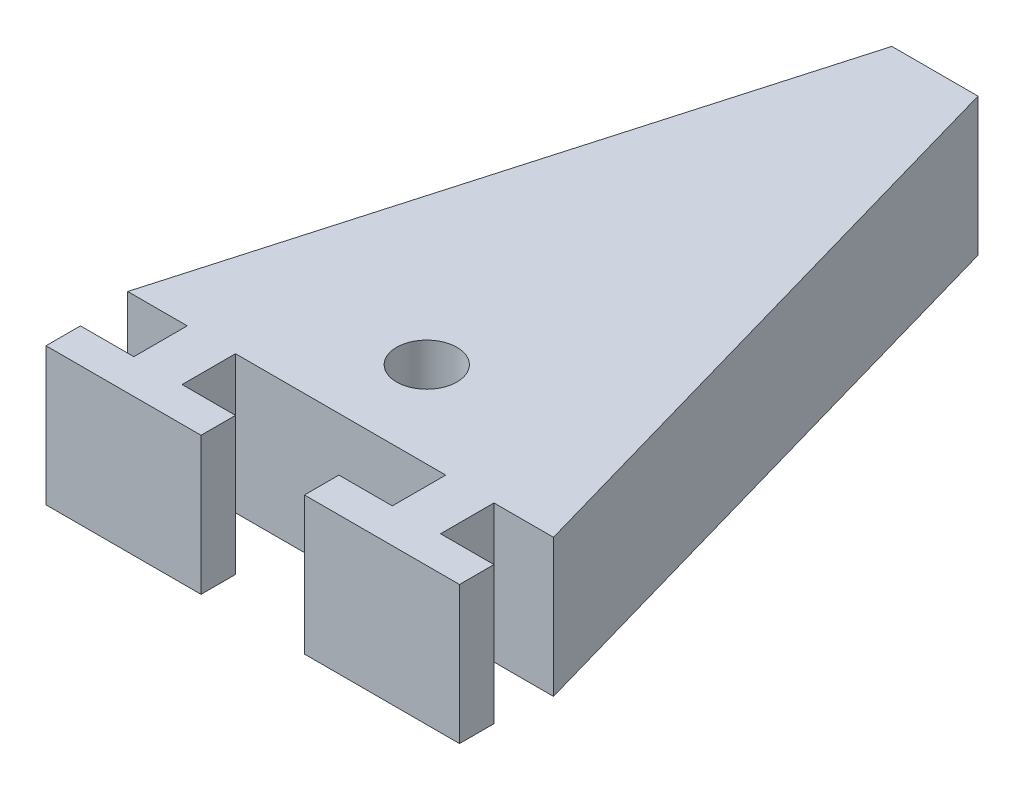
ISO-10303-21;
HEADER;
FILE_DESCRIPTION(('STEP AP214'),'2;1');
FILE_NAME('part.step','',(''),(''),'','','');
FILE_SCHEMA(('AUTOMOTIVE_DESIGN { 1 0 10303 214 1 1 1 1 }'));
ENDSEC;
DATA;
#1=APPLICATION_CONTEXT('core data for automotive mechanical design processes');
#2=APPLICATION_PROTOCOL_DEFINITION('international standard','automotive_design',2000,#1);
#3=PRODUCT_CONTEXT('',#1,'mechanical');
#4=PRODUCT('Part','Part','',(#3));
#5=PRODUCT_RELATED_PRODUCT_CATEGORY('part','',(#4));
#6=PRODUCT_DEFINITION_FORMATION('','',#4);
#7=PRODUCT_DEFINITION_CONTEXT('part definition',#1,'design');
#8=PRODUCT_DEFINITION('design','',#6,#7);
#9=PRODUCT_DEFINITION_SHAPE('','',#8);
#10=(LENGTH_UNIT() NAMED_UNIT(*) SI_UNIT(.MILLI.,.METRE.));
#11=(NAMED_UNIT(*) PLANE_ANGLE_UNIT() SI_UNIT($,.RADIAN.));
#12=(NAMED_UNIT(*) SI_UNIT($,.STERADIAN.) SOLID_ANGLE_UNIT());
#13=UNCERTAINTY_MEASURE_WITH_UNIT(LENGTH_MEASURE(1.E-05),#10,'distance_accuracy_value','');
#14=(GEOMETRIC_REPRESENTATION_CONTEXT(3) GLOBAL_UNCERTAINTY_ASSIGNED_CONTEXT((#13)) GLOBAL_UNIT_ASSIGNED_CONTEXT((#10,
#11,#12)) REPRESENTATION_CONTEXT('',''));
#15=CARTESIAN_POINT('',(0.,0.,0.));
#16=DIRECTION('',(0.,0.,1.));
#17=DIRECTION('',(1.,0.,0.));
#18=AXIS2_PLACEMENT_3D('',#15,#16,#17);
#19=CARTESIAN_POINT('',(12.5,8.,0.));
#20=DIRECTION('',(-0.961523947640823,0.,0.274721127897378));
#21=DIRECTION('',(0.274721127897378,0.,0.961523947640823));
#22=AXIS2_PLACEMENT_3D('',#19,#20,#21);
#23=PLANE('',#22);
#24=DIRECTION('',(-0.274721127897378,0.,-0.961523947640823));
#25=VECTOR('',#24,1.);
#26=CARTESIAN_POINT('',(12.5,8.,0.));
#27=LINE('',#26,#25);
#28=CARTESIAN_POINT('',(12.3571428571429,8.,-0.5));
#29=VERTEX_POINT('',#28);
#30=CARTESIAN_POINT('',(2.5,8.,-35.));
#31=VERTEX_POINT('',#30);
#32=EDGE_CURVE('E167',#29,#31,#27,.T.);
#33=ORIENTED_EDGE('',*,*,#32,.F.);
#34=DIRECTION('',(0.,1.,0.));
#35=VECTOR('',#34,1.);
#36=CARTESIAN_POINT('',(12.3571428571429,0.,-0.5));
#37=LINE('',#36,#35);
#38=CARTESIAN_POINT('',(12.3571428571429,0.,-0.5));
#39=VERTEX_POINT('',#38);
#40=EDGE_CURVE('E229',#39,#29,#37,.T.);
#41=ORIENTED_EDGE('',*,*,#40,.F.);
#42=DIRECTION('',(-0.274721127897378,0.,-0.961523947640823));
#43=VECTOR('',#42,1.);
#44=CARTESIAN_POINT('',(12.5,0.,0.));
#45=LINE('',#44,#43);
#46=CARTESIAN_POINT('',(2.5,0.,-35.));
#47=VERTEX_POINT('',#46);
#48=EDGE_CURVE('E60',#39,#47,#45,.T.);
#49=ORIENTED_EDGE('',*,*,#48,.T.);
#50=DIRECTION('',(0.,-1.,0.));
#51=VECTOR('',#50,1.);
#52=CARTESIAN_POINT('',(2.5,8.,-35.));
#53=LINE('',#52,#51);
#54=EDGE_CURVE('E11',#31,#47,#53,.T.);
#55=ORIENTED_EDGE('',*,*,#54,.F.);
#56=EDGE_LOOP('',(#33,#41,#49,#55));
#57=FACE_BOUND('',#56,.T.);
#58=ADVANCED_FACE('F33',(#57),#23,.F.);
#59=CARTESIAN_POINT('',(2.5,8.,-35.));
#60=DIRECTION('',(0.,0.,1.));
#61=DIRECTION('',(1.,0.,0.));
#62=AXIS2_PLACEMENT_3D('',#59,#60,#61);
#63=PLANE('',#62);
#64=DIRECTION('',(-1.,0.,0.));
#65=VECTOR('',#64,1.);
#66=CARTESIAN_POINT('',(2.5,0.,-35.));
#67=LINE('',#66,#65);
#68=CARTESIAN_POINT('',(-2.5,0.,-35.));
#69=VERTEX_POINT('',#68);
#70=EDGE_CURVE('E174',#47,#69,#67,.T.);
#71=ORIENTED_EDGE('',*,*,#70,.T.);
#72=DIRECTION('',(0.,-1.,0.));
#73=VECTOR('',#72,1.);
#74=CARTESIAN_POINT('',(-2.5,8.,-35.));
#75=LINE('',#74,#73);
#76=CARTESIAN_POINT('',(-2.5,8.,-35.));
#77=VERTEX_POINT('',#76);
#78=EDGE_CURVE('E41',#77,#69,#75,.T.);
#79=ORIENTED_EDGE('',*,*,#78,.F.);
#80=DIRECTION('',(-1.,0.,0.));
#81=VECTOR('',#80,1.);
#82=CARTESIAN_POINT('',(2.5,8.,-35.));
#83=LINE('',#82,#81);
#84=EDGE_CURVE('E49',#31,#77,#83,.T.);
#85=ORIENTED_EDGE('',*,*,#84,.F.);
#86=ORIENTED_EDGE('',*,*,#54,.T.);
#87=EDGE_LOOP('',(#71,#79,#85,#86));
#88=FACE_BOUND('',#87,.T.);
#89=ADVANCED_FACE('F410',(#88),#63,.F.);
#90=CARTESIAN_POINT('',(-2.5,8.,-35.));
#91=DIRECTION('',(0.961523947640823,0.,0.274721127897378));
#92=DIRECTION('',(0.274721127897378,0.,-0.961523947640823));
#93=AXIS2_PLACEMENT_3D('',#90,#91,#92);
#94=PLANE('',#93);
#95=DIRECTION('',(-0.274721127897378,0.,0.961523947640823));
#96=VECTOR('',#95,1.);
#97=CARTESIAN_POINT('',(-2.5,0.,-35.));
#98=LINE('',#97,#96);
#99=CARTESIAN_POINT('',(-12.3571428571429,0.,-0.5));
#100=VERTEX_POINT('',#99);
#101=EDGE_CURVE('E169',#69,#100,#98,.T.);
#102=ORIENTED_EDGE('',*,*,#101,.T.);
#103=DIRECTION('',(0.,1.,0.));
#104=VECTOR('',#103,1.);
#105=CARTESIAN_POINT('',(-12.3571428571429,0.,-0.5));
#106=LINE('',#105,#104);
#107=CARTESIAN_POINT('',(-12.3571428571429,8.,-0.5));
#108=VERTEX_POINT('',#107);
#109=EDGE_CURVE('E203',#100,#108,#106,.T.);
#110=ORIENTED_EDGE('',*,*,#109,.T.);
#111=DIRECTION('',(-0.274721127897378,0.,0.961523947640823));
#112=VECTOR('',#111,1.);
#113=CARTESIAN_POINT('',(-2.5,8.,-35.));
#114=LINE('',#113,#112);
#115=EDGE_CURVE('E171',#77,#108,#114,.T.);
#116=ORIENTED_EDGE('',*,*,#115,.F.);
#117=ORIENTED_EDGE('',*,*,#78,.T.);
#118=EDGE_LOOP('',(#102,#110,#116,#117));
#119=FACE_BOUND('',#118,.T.);
#120=ADVANCED_FACE('F181',(#119),#94,.F.);
#121=CARTESIAN_POINT('',(0.,8.,0.));
#122=DIRECTION('',(0.,1.,0.));
#123=DIRECTION('',(0.,0.,1.));
#124=AXIS2_PLACEMENT_3D('',#121,#122,#123);
#125=PLANE('',#124);
#126=CARTESIAN_POINT('',(0.,8.,-5.5));
#127=DIRECTION('',(0.,-1.,0.));
#128=DIRECTION('',(0.,0.,-1.));
#129=AXIS2_PLACEMENT_3D('',#126,#127,#128);
#130=CIRCLE('',#129,1.75);
#131=CARTESIAN_POINT('',(0.,8.,-7.25));
#132=VERTEX_POINT('',#131);
#133=EDGE_CURVE('E233',#132,#132,#130,.T.);
#134=ORIENTED_EDGE('',*,*,#133,.T.);
#135=EDGE_LOOP('',(#134));
#136=FACE_BOUND('',#135,.T.);
#137=DIRECTION('',(-1.,0.,0.));
#138=VECTOR('',#137,1.);
#139=CARTESIAN_POINT('',(-8.90166666666667,8.,-0.5));
#140=LINE('',#139,#138);
#141=CARTESIAN_POINT('',(-8.90166666666667,8.,-0.5));
#142=VERTEX_POINT('',#141);
#143=EDGE_CURVE('E201',#142,#108,#140,.T.);
#144=ORIENTED_EDGE('',*,*,#143,.F.);
#145=DIRECTION('',(0.,0.,1.));
#146=VECTOR('',#145,1.);
#147=CARTESIAN_POINT('',(-8.90166666666667,8.,0.));
#148=LINE('',#147,#146);
#149=CARTESIAN_POINT('',(-8.90166666666667,8.,2.6));
#150=VERTEX_POINT('',#149);
#151=EDGE_CURVE('E103',#142,#150,#148,.T.);
#152=ORIENTED_EDGE('',*,*,#151,.T.);
#153=DIRECTION('',(-1.,0.,0.));
#154=VECTOR('',#153,1.);
#155=CARTESIAN_POINT('',(-8.90166666666667,8.,2.6));
#156=LINE('',#155,#154);
#157=CARTESIAN_POINT('',(-12.0016666666667,8.,2.6));
#158=VERTEX_POINT('',#157);
#159=EDGE_CURVE('E297',#150,#158,#156,.T.);
#160=ORIENTED_EDGE('',*,*,#159,.T.);
#161=DIRECTION('',(0.,0.,1.));
#162=VECTOR('',#161,1.);
#163=CARTESIAN_POINT('',(-12.0016666666667,8.,2.6));
#164=LINE('',#163,#162);
#165=CARTESIAN_POINT('',(-12.0016666666667,8.,4.6));
#166=VERTEX_POINT('',#165);
#167=EDGE_CURVE('E121',#158,#166,#164,.T.);
#168=ORIENTED_EDGE('',*,*,#167,.T.);
#169=DIRECTION('',(1.,0.,0.));
#170=VECTOR('',#169,1.);
#171=CARTESIAN_POINT('',(-12.0016666666667,8.,4.6));
#172=LINE('',#171,#170);
#173=CARTESIAN_POINT('',(-3.00166666666666,8.,4.6));
#174=VERTEX_POINT('',#173);
#175=EDGE_CURVE('E114',#166,#174,#172,.T.);
#176=ORIENTED_EDGE('',*,*,#175,.T.);
#177=DIRECTION('',(0.,0.,-1.));
#178=VECTOR('',#177,1.);
#179=CARTESIAN_POINT('',(-3.00166666666666,8.,4.6));
#180=LINE('',#179,#178);
#181=CARTESIAN_POINT('',(-3.00166666666667,8.,2.6));
#182=VERTEX_POINT('',#181);
#183=EDGE_CURVE('E118',#174,#182,#180,.T.);
#184=ORIENTED_EDGE('',*,*,#183,.T.);
#185=DIRECTION('',(-1.,0.,0.));
#186=VECTOR('',#185,1.);
#187=CARTESIAN_POINT('',(-3.00166666666667,8.,2.6));
#188=LINE('',#187,#186);
#189=CARTESIAN_POINT('',(-6.10166666666667,8.,2.6));
#190=VERTEX_POINT('',#189);
#191=EDGE_CURVE('E68',#182,#190,#188,.T.);
#192=ORIENTED_EDGE('',*,*,#191,.T.);
#193=DIRECTION('',(0.,0.,-1.));
#194=VECTOR('',#193,1.);
#195=CARTESIAN_POINT('',(-6.10166666666667,8.,2.6));
#196=LINE('',#195,#194);
#197=CARTESIAN_POINT('',(-6.10166666666667,8.,-0.5));
#198=VERTEX_POINT('',#197);
#199=EDGE_CURVE('E138',#190,#198,#196,.T.);
#200=ORIENTED_EDGE('',*,*,#199,.T.);
#201=DIRECTION('',(-1.,0.,0.));
#202=VECTOR('',#201,1.);
#203=CARTESIAN_POINT('',(-6.10166666666667,8.,-0.5));
#204=LINE('',#203,#202);
#205=CARTESIAN_POINT('',(6.10166666666667,8.,-0.5));
#206=VERTEX_POINT('',#205);
#207=EDGE_CURVE('E218',#206,#198,#204,.T.);
#208=ORIENTED_EDGE('',*,*,#207,.F.);
#209=DIRECTION('',(0.,0.,-1.));
#210=VECTOR('',#209,1.);
#211=CARTESIAN_POINT('',(6.10166666666667,8.,2.6));
#212=LINE('',#211,#210);
#213=CARTESIAN_POINT('',(6.10166666666667,8.,2.6));
#214=VERTEX_POINT('',#213);
#215=EDGE_CURVE('E238',#214,#206,#212,.T.);
#216=ORIENTED_EDGE('',*,*,#215,.F.);
#217=DIRECTION('',(1.,0.,0.));
#218=VECTOR('',#217,1.);
#219=CARTESIAN_POINT('',(3.00166666666667,8.,2.6));
#220=LINE('',#219,#218);
#221=CARTESIAN_POINT('',(3.00166666666667,8.,2.6));
#222=VERTEX_POINT('',#221);
#223=EDGE_CURVE('E241',#222,#214,#220,.T.);
#224=ORIENTED_EDGE('',*,*,#223,.F.);
#225=DIRECTION('',(0.,0.,-1.));
#226=VECTOR('',#225,1.);
#227=CARTESIAN_POINT('',(3.00166666666666,8.,4.6));
#228=LINE('',#227,#226);
#229=CARTESIAN_POINT('',(3.00166666666666,8.,4.6));
#230=VERTEX_POINT('',#229);
#231=EDGE_CURVE('E245',#230,#222,#228,.T.);
#232=ORIENTED_EDGE('',*,*,#231,.F.);
#233=DIRECTION('',(-1.,0.,0.));
#234=VECTOR('',#233,1.);
#235=CARTESIAN_POINT('',(12.0016666666667,8.,4.6));
#236=LINE('',#235,#234);
#237=CARTESIAN_POINT('',(12.0016666666667,8.,4.6));
#238=VERTEX_POINT('',#237);
#239=EDGE_CURVE('E248',#238,#230,#236,.T.);
#240=ORIENTED_EDGE('',*,*,#239,.F.);
#241=DIRECTION('',(0.,0.,1.));
#242=VECTOR('',#241,1.);
#243=CARTESIAN_POINT('',(12.0016666666667,8.,2.6));
#244=LINE('',#243,#242);
#245=CARTESIAN_POINT('',(12.0016666666667,8.,2.6));
#246=VERTEX_POINT('',#245);
#247=EDGE_CURVE('E251',#246,#238,#244,.T.);
#248=ORIENTED_EDGE('',*,*,#247,.F.);
#249=DIRECTION('',(1.,0.,0.));
#250=VECTOR('',#249,1.);
#251=CARTESIAN_POINT('',(8.90166666666667,8.,2.6));
#252=LINE('',#251,#250);
#253=CARTESIAN_POINT('',(8.90166666666667,8.,2.6));
#254=VERTEX_POINT('',#253);
#255=EDGE_CURVE('E254',#254,#246,#252,.T.);
#256=ORIENTED_EDGE('',*,*,#255,.F.);
#257=DIRECTION('',(0.,0.,1.));
#258=VECTOR('',#257,1.);
#259=CARTESIAN_POINT('',(8.90166666666667,8.,0.));
#260=LINE('',#259,#258);
#261=CARTESIAN_POINT('',(8.90166666666667,8.,-0.5));
#262=VERTEX_POINT('',#261);
#263=EDGE_CURVE('E257',#262,#254,#260,.T.);
#264=ORIENTED_EDGE('',*,*,#263,.F.);
#265=DIRECTION('',(-1.,0.,0.));
#266=VECTOR('',#265,1.);
#267=CARTESIAN_POINT('',(8.90166666666667,8.,-0.5));
#268=LINE('',#267,#266);
#269=EDGE_CURVE('E230',#29,#262,#268,.T.);
#270=ORIENTED_EDGE('',*,*,#269,.F.);
#271=ORIENTED_EDGE('',*,*,#32,.T.);
#272=ORIENTED_EDGE('',*,*,#84,.T.);
#273=ORIENTED_EDGE('',*,*,#115,.T.);
#274=EDGE_LOOP('',(#144,#152,#160,#168,#176,#184,#192,#200,#208,#216,#224,#232,#240,#248,#256,
#264,#270,#271,#272,#273));
#275=FACE_BOUND('',#274,.T.);
#276=ADVANCED_FACE('F116',(#136,#275),#125,.T.);
#277=CARTESIAN_POINT('',(0.,0.,0.));
#278=DIRECTION('',(0.,1.,0.));
#279=DIRECTION('',(0.,0.,1.));
#280=AXIS2_PLACEMENT_3D('',#277,#278,#279);
#281=PLANE('',#280);
#282=CARTESIAN_POINT('',(0.,0.,-5.5));
#283=DIRECTION('',(0.,-1.,0.));
#284=DIRECTION('',(0.,0.,-1.));
#285=AXIS2_PLACEMENT_3D('',#282,#283,#284);
#286=CIRCLE('',#285,1.75);
#287=CARTESIAN_POINT('',(0.,0.,-7.25));
#288=VERTEX_POINT('',#287);
#289=EDGE_CURVE('E209',#288,#288,#286,.T.);
#290=ORIENTED_EDGE('',*,*,#289,.F.);
#291=EDGE_LOOP('',(#290));
#292=FACE_BOUND('',#291,.T.);
#293=DIRECTION('',(0.,0.,1.));
#294=VECTOR('',#293,1.);
#295=CARTESIAN_POINT('',(-8.90166666666667,0.,0.));
#296=LINE('',#295,#294);
#297=CARTESIAN_POINT('',(-8.90166666666667,0.,-0.5));
#298=VERTEX_POINT('',#297);
#299=CARTESIAN_POINT('',(-8.90166666666667,0.,2.6));
#300=VERTEX_POINT('',#299);
#301=EDGE_CURVE('E144',#298,#300,#296,.T.);
#302=ORIENTED_EDGE('',*,*,#301,.F.);
#303=DIRECTION('',(-1.,0.,0.));
#304=VECTOR('',#303,1.);
#305=CARTESIAN_POINT('',(-8.90166666666667,0.,-0.5));
#306=LINE('',#305,#304);
#307=EDGE_CURVE('E191',#298,#100,#306,.T.);
#308=ORIENTED_EDGE('',*,*,#307,.T.);
#309=ORIENTED_EDGE('',*,*,#101,.F.);
#310=ORIENTED_EDGE('',*,*,#70,.F.);
#311=ORIENTED_EDGE('',*,*,#48,.F.);
#312=DIRECTION('',(-1.,0.,0.));
#313=VECTOR('',#312,1.);
#314=CARTESIAN_POINT('',(8.90166666666667,0.,-0.5));
#315=LINE('',#314,#313);
#316=CARTESIAN_POINT('',(8.90166666666667,0.,-0.5));
#317=VERTEX_POINT('',#316);
#318=EDGE_CURVE('E226',#39,#317,#315,.T.);
#319=ORIENTED_EDGE('',*,*,#318,.T.);
#320=DIRECTION('',(0.,0.,1.));
#321=VECTOR('',#320,1.);
#322=CARTESIAN_POINT('',(8.90166666666667,0.,0.));
#323=LINE('',#322,#321);
#324=CARTESIAN_POINT('',(8.90166666666667,0.,2.6));
#325=VERTEX_POINT('',#324);
#326=EDGE_CURVE('E242',#317,#325,#323,.T.);
#327=ORIENTED_EDGE('',*,*,#326,.T.);
#328=DIRECTION('',(1.,0.,0.));
#329=VECTOR('',#328,1.);
#330=CARTESIAN_POINT('',(8.90166666666667,0.,2.6));
#331=LINE('',#330,#329);
#332=CARTESIAN_POINT('',(12.0016666666667,0.,2.6));
#333=VERTEX_POINT('',#332);
#334=EDGE_CURVE('E275',#325,#333,#331,.T.);
#335=ORIENTED_EDGE('',*,*,#334,.T.);
#336=DIRECTION('',(0.,0.,1.));
#337=VECTOR('',#336,1.);
#338=CARTESIAN_POINT('',(12.0016666666667,0.,2.6));
#339=LINE('',#338,#337);
#340=CARTESIAN_POINT('',(12.0016666666667,0.,4.6));
#341=VERTEX_POINT('',#340);
#342=EDGE_CURVE('E272',#333,#341,#339,.T.);
#343=ORIENTED_EDGE('',*,*,#342,.T.);
#344=DIRECTION('',(-1.,0.,0.));
#345=VECTOR('',#344,1.);
#346=CARTESIAN_POINT('',(12.0016666666667,0.,4.6));
#347=LINE('',#346,#345);
#348=CARTESIAN_POINT('',(3.00166666666666,0.,4.6));
#349=VERTEX_POINT('',#348);
#350=EDGE_CURVE('E269',#341,#349,#347,.T.);
#351=ORIENTED_EDGE('',*,*,#350,.T.);
#352=DIRECTION('',(0.,0.,-1.));
#353=VECTOR('',#352,1.);
#354=CARTESIAN_POINT('',(3.00166666666666,0.,4.6));
#355=LINE('',#354,#353);
#356=CARTESIAN_POINT('',(3.00166666666667,0.,2.6));
#357=VERTEX_POINT('',#356);
#358=EDGE_CURVE('E266',#349,#357,#355,.T.);
#359=ORIENTED_EDGE('',*,*,#358,.T.);
#360=DIRECTION('',(1.,0.,0.));
#361=VECTOR('',#360,1.);
#362=CARTESIAN_POINT('',(3.00166666666667,0.,2.6));
#363=LINE('',#362,#361);
#364=CARTESIAN_POINT('',(6.10166666666667,0.,2.6));
#365=VERTEX_POINT('',#364);
#366=EDGE_CURVE('E263',#357,#365,#363,.T.);
#367=ORIENTED_EDGE('',*,*,#366,.T.);
#368=DIRECTION('',(0.,0.,-1.));
#369=VECTOR('',#368,1.);
#370=CARTESIAN_POINT('',(6.10166666666667,0.,2.6));
#371=LINE('',#370,#369);
#372=CARTESIAN_POINT('',(6.10166666666667,0.,-0.5));
#373=VERTEX_POINT('',#372);
#374=EDGE_CURVE('E212',#365,#373,#371,.T.);
#375=ORIENTED_EDGE('',*,*,#374,.T.);
#376=DIRECTION('',(-1.,0.,0.));
#377=VECTOR('',#376,1.);
#378=CARTESIAN_POINT('',(-6.10166666666667,0.,-0.5));
#379=LINE('',#378,#377);
#380=CARTESIAN_POINT('',(-6.10166666666667,0.,-0.5));
#381=VERTEX_POINT('',#380);
#382=EDGE_CURVE('E214',#373,#381,#379,.T.);
#383=ORIENTED_EDGE('',*,*,#382,.T.);
#384=DIRECTION('',(0.,0.,-1.));
#385=VECTOR('',#384,1.);
#386=CARTESIAN_POINT('',(-6.10166666666667,0.,2.6));
#387=LINE('',#386,#385);
#388=CARTESIAN_POINT('',(-6.10166666666667,0.,2.6));
#389=VERTEX_POINT('',#388);
#390=EDGE_CURVE('E155',#389,#381,#387,.T.);
#391=ORIENTED_EDGE('',*,*,#390,.F.);
#392=DIRECTION('',(-1.,0.,0.));
#393=VECTOR('',#392,1.);
#394=CARTESIAN_POINT('',(-3.00166666666667,0.,2.6));
#395=LINE('',#394,#393);
#396=CARTESIAN_POINT('',(-3.00166666666667,0.,2.6));
#397=VERTEX_POINT('',#396);
#398=EDGE_CURVE('E95',#397,#389,#395,.T.);
#399=ORIENTED_EDGE('',*,*,#398,.F.);
#400=DIRECTION('',(0.,0.,-1.));
#401=VECTOR('',#400,1.);
#402=CARTESIAN_POINT('',(-3.00166666666666,0.,4.6));
#403=LINE('',#402,#401);
#404=CARTESIAN_POINT('',(-3.00166666666666,0.,4.6));
#405=VERTEX_POINT('',#404);
#406=EDGE_CURVE('E152',#405,#397,#403,.T.);
#407=ORIENTED_EDGE('',*,*,#406,.F.);
#408=DIRECTION('',(1.,0.,0.));
#409=VECTOR('',#408,1.);
#410=CARTESIAN_POINT('',(-12.0016666666667,0.,4.6));
#411=LINE('',#410,#409);
#412=CARTESIAN_POINT('',(-12.0016666666667,0.,4.6));
#413=VERTEX_POINT('',#412);
#414=EDGE_CURVE('E130',#413,#405,#411,.T.);
#415=ORIENTED_EDGE('',*,*,#414,.F.);
#416=DIRECTION('',(0.,0.,1.));
#417=VECTOR('',#416,1.);
#418=CARTESIAN_POINT('',(-12.0016666666667,0.,2.6));
#419=LINE('',#418,#417);
#420=CARTESIAN_POINT('',(-12.0016666666667,0.,2.6));
#421=VERTEX_POINT('',#420);
#422=EDGE_CURVE('E149',#421,#413,#419,.T.);
#423=ORIENTED_EDGE('',*,*,#422,.F.);
#424=DIRECTION('',(-1.,0.,0.));
#425=VECTOR('',#424,1.);
#426=CARTESIAN_POINT('',(-8.90166666666667,0.,2.6));
#427=LINE('',#426,#425);
#428=EDGE_CURVE('E146',#300,#421,#427,.T.);
#429=ORIENTED_EDGE('',*,*,#428,.F.);
#430=EDGE_LOOP('',(#302,#308,#309,#310,#311,#319,#327,#335,#343,#351,#359,#367,#375,#383,#391,
#399,#407,#415,#423,#429));
#431=FACE_BOUND('',#430,.T.);
#432=ADVANCED_FACE('F189',(#292,#431),#281,.F.);
#433=CARTESIAN_POINT('',(-8.90166666666667,8.,0.));
#434=DIRECTION('',(1.,0.,0.));
#435=DIRECTION('',(0.,0.,-1.));
#436=AXIS2_PLACEMENT_3D('',#433,#434,#435);
#437=PLANE('',#436);
#438=ORIENTED_EDGE('',*,*,#301,.T.);
#439=DIRECTION('',(0.,-1.,0.));
#440=VECTOR('',#439,1.);
#441=CARTESIAN_POINT('',(-8.90166666666667,8.,2.6));
#442=LINE('',#441,#440);
#443=EDGE_CURVE('E164',#150,#300,#442,.T.);
#444=ORIENTED_EDGE('',*,*,#443,.F.);
#445=ORIENTED_EDGE('',*,*,#151,.F.);
#446=DIRECTION('',(0.,1.,0.));
#447=VECTOR('',#446,1.);
#448=CARTESIAN_POINT('',(-8.90166666666667,0.,-0.5));
#449=LINE('',#448,#447);
#450=EDGE_CURVE('E200',#298,#142,#449,.T.);
#451=ORIENTED_EDGE('',*,*,#450,.F.);
#452=EDGE_LOOP('',(#438,#444,#445,#451));
#453=FACE_BOUND('',#452,.T.);
#454=ADVANCED_FACE('F398',(#453),#437,.F.);
#455=CARTESIAN_POINT('',(-8.90166666666667,8.,2.6));
#456=DIRECTION('',(0.,0.,1.));
#457=DIRECTION('',(1.,0.,0.));
#458=AXIS2_PLACEMENT_3D('',#455,#456,#457);
#459=PLANE('',#458);
#460=ORIENTED_EDGE('',*,*,#428,.T.);
#461=DIRECTION('',(0.,-1.,0.));
#462=VECTOR('',#461,1.);
#463=CARTESIAN_POINT('',(-12.0016666666667,8.,2.6));
#464=LINE('',#463,#462);
#465=EDGE_CURVE('E161',#158,#421,#464,.T.);
#466=ORIENTED_EDGE('',*,*,#465,.F.);
#467=ORIENTED_EDGE('',*,*,#159,.F.);
#468=ORIENTED_EDGE('',*,*,#443,.T.);
#469=EDGE_LOOP('',(#460,#466,#467,#468));
#470=FACE_BOUND('',#469,.T.);
#471=ADVANCED_FACE('F301',(#470),#459,.F.);
#472=CARTESIAN_POINT('',(-12.0016666666667,8.,2.6));
#473=DIRECTION('',(1.,0.,0.));
#474=DIRECTION('',(0.,0.,-1.));
#475=AXIS2_PLACEMENT_3D('',#472,#473,#474);
#476=PLANE('',#475);
#477=ORIENTED_EDGE('',*,*,#422,.T.);
#478=DIRECTION('',(0.,-1.,0.));
#479=VECTOR('',#478,1.);
#480=CARTESIAN_POINT('',(-12.0016666666667,8.,4.6));
#481=LINE('',#480,#479);
#482=EDGE_CURVE('E133',#166,#413,#481,.T.);
#483=ORIENTED_EDGE('',*,*,#482,.F.);
#484=ORIENTED_EDGE('',*,*,#167,.F.);
#485=ORIENTED_EDGE('',*,*,#465,.T.);
#486=EDGE_LOOP('',(#477,#483,#484,#485));
#487=FACE_BOUND('',#486,.T.);
#488=ADVANCED_FACE('F304',(#487),#476,.F.);
#489=CARTESIAN_POINT('',(-12.0016666666667,8.,4.6));
#490=DIRECTION('',(0.,0.,-1.));
#491=DIRECTION('',(-1.,0.,0.));
#492=AXIS2_PLACEMENT_3D('',#489,#490,#491);
#493=PLANE('',#492);
#494=ORIENTED_EDGE('',*,*,#414,.T.);
#495=DIRECTION('',(0.,-1.,0.));
#496=VECTOR('',#495,1.);
#497=CARTESIAN_POINT('',(-3.00166666666666,8.,4.6));
#498=LINE('',#497,#496);
#499=EDGE_CURVE('E127',#174,#405,#498,.T.);
#500=ORIENTED_EDGE('',*,*,#499,.F.);
#501=ORIENTED_EDGE('',*,*,#175,.F.);
#502=ORIENTED_EDGE('',*,*,#482,.T.);
#503=EDGE_LOOP('',(#494,#500,#501,#502));
#504=FACE_BOUND('',#503,.T.);
#505=ADVANCED_FACE('F128',(#504),#493,.F.);
#506=CARTESIAN_POINT('',(-3.00166666666666,8.,4.6));
#507=DIRECTION('',(-1.,0.,0.));
#508=DIRECTION('',(0.,0.,1.));
#509=AXIS2_PLACEMENT_3D('',#506,#507,#508);
#510=PLANE('',#509);
#511=ORIENTED_EDGE('',*,*,#406,.T.);
#512=DIRECTION('',(0.,-1.,0.));
#513=VECTOR('',#512,1.);
#514=CARTESIAN_POINT('',(-3.00166666666667,8.,2.6));
#515=LINE('',#514,#513);
#516=EDGE_CURVE('E134',#182,#397,#515,.T.);
#517=ORIENTED_EDGE('',*,*,#516,.F.);
#518=ORIENTED_EDGE('',*,*,#183,.F.);
#519=ORIENTED_EDGE('',*,*,#499,.T.);
#520=EDGE_LOOP('',(#511,#517,#518,#519));
#521=FACE_BOUND('',#520,.T.);
#522=ADVANCED_FACE('F136',(#521),#510,.F.);
#523=CARTESIAN_POINT('',(-3.00166666666667,8.,2.6));
#524=DIRECTION('',(0.,0.,1.));
#525=DIRECTION('',(1.,0.,0.));
#526=AXIS2_PLACEMENT_3D('',#523,#524,#525);
#527=PLANE('',#526);
#528=ORIENTED_EDGE('',*,*,#398,.T.);
#529=DIRECTION('',(0.,-1.,0.));
#530=VECTOR('',#529,1.);
#531=CARTESIAN_POINT('',(-6.10166666666667,8.,2.6));
#532=LINE('',#531,#530);
#533=EDGE_CURVE('E143',#190,#389,#532,.T.);
#534=ORIENTED_EDGE('',*,*,#533,.F.);
#535=ORIENTED_EDGE('',*,*,#191,.F.);
#536=ORIENTED_EDGE('',*,*,#516,.T.);
#537=EDGE_LOOP('',(#528,#534,#535,#536));
#538=FACE_BOUND('',#537,.T.);
#539=ADVANCED_FACE('F306',(#538),#527,.F.);
#540=CARTESIAN_POINT('',(-6.10166666666667,8.,2.6));
#541=DIRECTION('',(-1.,0.,0.));
#542=DIRECTION('',(0.,0.,1.));
#543=AXIS2_PLACEMENT_3D('',#540,#541,#542);
#544=PLANE('',#543);
#545=ORIENTED_EDGE('',*,*,#390,.T.);
#546=DIRECTION('',(0.,1.,0.));
#547=VECTOR('',#546,1.);
#548=CARTESIAN_POINT('',(-6.10166666666667,0.,-0.5));
#549=LINE('',#548,#547);
#550=EDGE_CURVE('E206',#381,#198,#549,.T.);
#551=ORIENTED_EDGE('',*,*,#550,.T.);
#552=ORIENTED_EDGE('',*,*,#199,.F.);
#553=ORIENTED_EDGE('',*,*,#533,.T.);
#554=EDGE_LOOP('',(#545,#551,#552,#553));
#555=FACE_BOUND('',#554,.T.);
#556=ADVANCED_FACE('F309',(#555),#544,.F.);
#557=CARTESIAN_POINT('',(6.10166666666667,8.,2.6));
#558=DIRECTION('',(-1.,0.,0.));
#559=DIRECTION('',(0.,0.,1.));
#560=AXIS2_PLACEMENT_3D('',#557,#558,#559);
#561=PLANE('',#560);
#562=ORIENTED_EDGE('',*,*,#374,.F.);
#563=DIRECTION('',(0.,-1.,0.));
#564=VECTOR('',#563,1.);
#565=CARTESIAN_POINT('',(6.10166666666667,8.,2.6));
#566=LINE('',#565,#564);
#567=EDGE_CURVE('E147',#214,#365,#566,.T.);
#568=ORIENTED_EDGE('',*,*,#567,.F.);
#569=ORIENTED_EDGE('',*,*,#215,.T.);
#570=DIRECTION('',(0.,1.,0.));
#571=VECTOR('',#570,1.);
#572=CARTESIAN_POINT('',(6.10166666666667,0.,-0.5));
#573=LINE('',#572,#571);
#574=EDGE_CURVE('E217',#373,#206,#573,.T.);
#575=ORIENTED_EDGE('',*,*,#574,.F.);
#576=EDGE_LOOP('',(#562,#568,#569,#575));
#577=FACE_BOUND('',#576,.T.);
#578=ADVANCED_FACE('F388',(#577),#561,.T.);
#579=CARTESIAN_POINT('',(3.00166666666667,8.,2.6));
#580=DIRECTION('',(0.,0.,-1.));
#581=DIRECTION('',(-1.,0.,0.));
#582=AXIS2_PLACEMENT_3D('',#579,#580,#581);
#583=PLANE('',#582);
#584=ORIENTED_EDGE('',*,*,#366,.F.);
#585=DIRECTION('',(0.,-1.,0.));
#586=VECTOR('',#585,1.);
#587=CARTESIAN_POINT('',(3.00166666666667,8.,2.6));
#588=LINE('',#587,#586);
#589=EDGE_CURVE('E291',#222,#357,#588,.T.);
#590=ORIENTED_EDGE('',*,*,#589,.F.);
#591=ORIENTED_EDGE('',*,*,#223,.T.);
#592=ORIENTED_EDGE('',*,*,#567,.T.);
#593=EDGE_LOOP('',(#584,#590,#591,#592));
#594=FACE_BOUND('',#593,.T.);
#595=ADVANCED_FACE('F383',(#594),#583,.T.);
#596=CARTESIAN_POINT('',(3.00166666666666,8.,4.6));
#597=DIRECTION('',(-1.,0.,0.));
#598=DIRECTION('',(0.,0.,1.));
#599=AXIS2_PLACEMENT_3D('',#596,#597,#598);
#600=PLANE('',#599);
#601=ORIENTED_EDGE('',*,*,#358,.F.);
#602=DIRECTION('',(0.,-1.,0.));
#603=VECTOR('',#602,1.);
#604=CARTESIAN_POINT('',(3.00166666666666,8.,4.6));
#605=LINE('',#604,#603);
#606=EDGE_CURVE('E288',#230,#349,#605,.T.);
#607=ORIENTED_EDGE('',*,*,#606,.F.);
#608=ORIENTED_EDGE('',*,*,#231,.T.);
#609=ORIENTED_EDGE('',*,*,#589,.T.);
#610=EDGE_LOOP('',(#601,#607,#608,#609));
#611=FACE_BOUND('',#610,.T.);
#612=ADVANCED_FACE('F379',(#611),#600,.T.);
#613=CARTESIAN_POINT('',(12.0016666666667,8.,4.6));
#614=DIRECTION('',(0.,0.,1.));
#615=DIRECTION('',(1.,0.,0.));
#616=AXIS2_PLACEMENT_3D('',#613,#614,#615);
#617=PLANE('',#616);
#618=ORIENTED_EDGE('',*,*,#350,.F.);
#619=DIRECTION('',(0.,-1.,0.));
#620=VECTOR('',#619,1.);
#621=CARTESIAN_POINT('',(12.0016666666667,8.,4.6));
#622=LINE('',#621,#620);
#623=EDGE_CURVE('E285',#238,#341,#622,.T.);
#624=ORIENTED_EDGE('',*,*,#623,.F.);
#625=ORIENTED_EDGE('',*,*,#239,.T.);
#626=ORIENTED_EDGE('',*,*,#606,.T.);
#627=EDGE_LOOP('',(#618,#624,#625,#626));
#628=FACE_BOUND('',#627,.T.);
#629=ADVANCED_FACE('F377',(#628),#617,.T.);
#630=CARTESIAN_POINT('',(12.0016666666667,8.,2.6));
#631=DIRECTION('',(1.,0.,0.));
#632=DIRECTION('',(0.,0.,-1.));
#633=AXIS2_PLACEMENT_3D('',#630,#631,#632);
#634=PLANE('',#633);
#635=ORIENTED_EDGE('',*,*,#342,.F.);
#636=DIRECTION('',(0.,-1.,0.));
#637=VECTOR('',#636,1.);
#638=CARTESIAN_POINT('',(12.0016666666667,8.,2.6));
#639=LINE('',#638,#637);
#640=EDGE_CURVE('E282',#246,#333,#639,.T.);
#641=ORIENTED_EDGE('',*,*,#640,.F.);
#642=ORIENTED_EDGE('',*,*,#247,.T.);
#643=ORIENTED_EDGE('',*,*,#623,.T.);
#644=EDGE_LOOP('',(#635,#641,#642,#643));
#645=FACE_BOUND('',#644,.T.);
#646=ADVANCED_FACE('F373',(#645),#634,.T.);
#647=CARTESIAN_POINT('',(8.90166666666667,8.,2.6));
#648=DIRECTION('',(0.,0.,-1.));
#649=DIRECTION('',(-1.,0.,0.));
#650=AXIS2_PLACEMENT_3D('',#647,#648,#649);
#651=PLANE('',#650);
#652=ORIENTED_EDGE('',*,*,#334,.F.);
#653=DIRECTION('',(0.,-1.,0.));
#654=VECTOR('',#653,1.);
#655=CARTESIAN_POINT('',(8.90166666666667,8.,2.6));
#656=LINE('',#655,#654);
#657=EDGE_CURVE('E260',#254,#325,#656,.T.);
#658=ORIENTED_EDGE('',*,*,#657,.F.);
#659=ORIENTED_EDGE('',*,*,#255,.T.);
#660=ORIENTED_EDGE('',*,*,#640,.T.);
#661=EDGE_LOOP('',(#652,#658,#659,#660));
#662=FACE_BOUND('',#661,.T.);
#663=ADVANCED_FACE('F364',(#662),#651,.T.);
#664=CARTESIAN_POINT('',(8.90166666666667,8.,0.));
#665=DIRECTION('',(1.,0.,0.));
#666=DIRECTION('',(0.,0.,-1.));
#667=AXIS2_PLACEMENT_3D('',#664,#665,#666);
#668=PLANE('',#667);
#669=ORIENTED_EDGE('',*,*,#326,.F.);
#670=DIRECTION('',(0.,1.,0.));
#671=VECTOR('',#670,1.);
#672=CARTESIAN_POINT('',(8.90166666666667,0.,-0.5));
#673=LINE('',#672,#671);
#674=EDGE_CURVE('E221',#317,#262,#673,.T.);
#675=ORIENTED_EDGE('',*,*,#674,.T.);
#676=ORIENTED_EDGE('',*,*,#263,.T.);
#677=ORIENTED_EDGE('',*,*,#657,.T.);
#678=EDGE_LOOP('',(#669,#675,#676,#677));
#679=FACE_BOUND('',#678,.T.);
#680=ADVANCED_FACE('F361',(#679),#668,.T.);
#681=CARTESIAN_POINT('',(8.90166666666667,0.,-0.5));
#682=DIRECTION('',(0.,0.,-1.));
#683=DIRECTION('',(-1.,0.,0.));
#684=AXIS2_PLACEMENT_3D('',#681,#682,#683);
#685=PLANE('',#684);
#686=ORIENTED_EDGE('',*,*,#269,.T.);
#687=ORIENTED_EDGE('',*,*,#674,.F.);
#688=ORIENTED_EDGE('',*,*,#318,.F.);
#689=ORIENTED_EDGE('',*,*,#40,.T.);
#690=EDGE_LOOP('',(#686,#687,#688,#689));
#691=FACE_BOUND('',#690,.T.);
#692=ADVANCED_FACE('F366',(#691),#685,.F.);
#693=CARTESIAN_POINT('',(-6.10166666666667,0.,-0.5));
#694=DIRECTION('',(0.,0.,-1.));
#695=DIRECTION('',(-1.,0.,0.));
#696=AXIS2_PLACEMENT_3D('',#693,#694,#695);
#697=PLANE('',#696);
#698=ORIENTED_EDGE('',*,*,#207,.T.);
#699=ORIENTED_EDGE('',*,*,#550,.F.);
#700=ORIENTED_EDGE('',*,*,#382,.F.);
#701=ORIENTED_EDGE('',*,*,#574,.T.);
#702=EDGE_LOOP('',(#698,#699,#700,#701));
#703=FACE_BOUND('',#702,.T.);
#704=ADVANCED_FACE('F390',(#703),#697,.F.);
#705=CARTESIAN_POINT('',(-8.90166666666667,0.,-0.5));
#706=DIRECTION('',(0.,0.,-1.));
#707=DIRECTION('',(-1.,0.,0.));
#708=AXIS2_PLACEMENT_3D('',#705,#706,#707);
#709=PLANE('',#708);
#710=ORIENTED_EDGE('',*,*,#143,.T.);
#711=ORIENTED_EDGE('',*,*,#109,.F.);
#712=ORIENTED_EDGE('',*,*,#307,.F.);
#713=ORIENTED_EDGE('',*,*,#450,.T.);
#714=EDGE_LOOP('',(#710,#711,#712,#713));
#715=FACE_BOUND('',#714,.T.);
#716=ADVANCED_FACE('F396',(#715),#709,.F.);
#717=CARTESIAN_POINT('',(0.,8.,-5.5));
#718=DIRECTION('',(0.,-1.,0.));
#719=DIRECTION('',(0.,0.,-1.));
#720=AXIS2_PLACEMENT_3D('',#717,#718,#719);
#721=CYLINDRICAL_SURFACE('',#720,1.75);
#722=ORIENTED_EDGE('',*,*,#133,.F.);
#723=EDGE_LOOP('',(#722));
#724=FACE_BOUND('',#723,.T.);
#725=ORIENTED_EDGE('',*,*,#289,.T.);
#726=EDGE_LOOP('',(#725));
#727=FACE_BOUND('',#726,.T.);
#728=ADVANCED_FACE('F428',(#724,#727),#721,.F.);
#729=CLOSED_SHELL('',(#58,#89,#120,#276,#432,#454,#471,#488,#505,#522,#539,#556,#578,#595,#612,
#629,#646,#663,#680,#692,#704,#716,#728));
#730=MANIFOLD_SOLID_BREP('B2',#729);
#731=ADVANCED_BREP_SHAPE_REPRESENTATION('',(#18,#730),#14);
#732=SHAPE_DEFINITION_REPRESENTATION(#9,#731);
ENDSEC;
END-ISO-10303-21;
